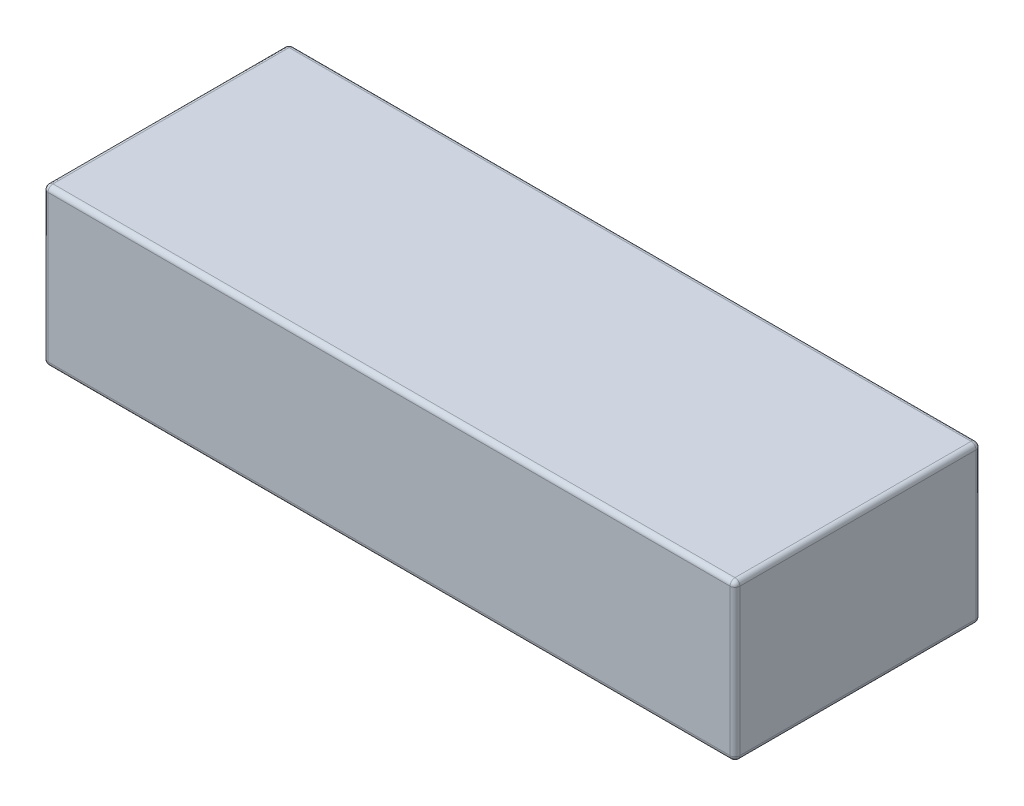
ISO-10303-21;
HEADER;
FILE_DESCRIPTION(('STEP AP214'),'2;1');
FILE_NAME('part.step','',(''),(''),'','','');
FILE_SCHEMA(('AUTOMOTIVE_DESIGN { 1 0 10303 214 1 1 1 1 }'));
ENDSEC;
DATA;
#1=APPLICATION_CONTEXT('core data for automotive mechanical design processes');
#2=APPLICATION_PROTOCOL_DEFINITION('international standard','automotive_design',2000,#1);
#3=PRODUCT_CONTEXT('',#1,'mechanical');
#4=PRODUCT('Part','Part','',(#3));
#5=PRODUCT_RELATED_PRODUCT_CATEGORY('part','',(#4));
#6=PRODUCT_DEFINITION_FORMATION('','',#4);
#7=PRODUCT_DEFINITION_CONTEXT('part definition',#1,'design');
#8=PRODUCT_DEFINITION('design','',#6,#7);
#9=PRODUCT_DEFINITION_SHAPE('','',#8);
#10=(LENGTH_UNIT() NAMED_UNIT(*) SI_UNIT(.MILLI.,.METRE.));
#11=(NAMED_UNIT(*) PLANE_ANGLE_UNIT() SI_UNIT($,.RADIAN.));
#12=(NAMED_UNIT(*) SI_UNIT($,.STERADIAN.) SOLID_ANGLE_UNIT());
#13=UNCERTAINTY_MEASURE_WITH_UNIT(LENGTH_MEASURE(1.E-05),#10,'distance_accuracy_value','');
#14=(GEOMETRIC_REPRESENTATION_CONTEXT(3) GLOBAL_UNCERTAINTY_ASSIGNED_CONTEXT((#13)) GLOBAL_UNIT_ASSIGNED_CONTEXT((#10,
#11,#12)) REPRESENTATION_CONTEXT('',''));
#15=CARTESIAN_POINT('',(0.,0.,0.));
#16=DIRECTION('',(0.,0.,1.));
#17=DIRECTION('',(1.,0.,0.));
#18=AXIS2_PLACEMENT_3D('',#15,#16,#17);
#19=CARTESIAN_POINT('',(70.05,15.85,-24.9));
#20=DIRECTION('',(-1.,0.,0.));
#21=DIRECTION('',(0.,0.,1.));
#22=AXIS2_PLACEMENT_3D('',#19,#20,#21);
#23=PLANE('',#22);
#24=DIRECTION('',(0.,-1.,0.));
#25=VECTOR('',#24,1.);
#26=CARTESIAN_POINT('',(70.05,15.85,23.9));
#27=LINE('',#26,#25);
#28=CARTESIAN_POINT('',(70.05,14.85,23.9));
#29=VERTEX_POINT('',#28);
#30=CARTESIAN_POINT('',(70.05,-14.85,23.9));
#31=VERTEX_POINT('',#30);
#32=EDGE_CURVE('E216',#29,#31,#27,.T.);
#33=ORIENTED_EDGE('',*,*,#32,.T.);
#34=DIRECTION('',(0.,0.,-1.));
#35=VECTOR('',#34,1.);
#36=CARTESIAN_POINT('',(70.05,-14.85,-24.9));
#37=LINE('',#36,#35);
#38=CARTESIAN_POINT('',(70.05,-14.85,-23.9));
#39=VERTEX_POINT('',#38);
#40=EDGE_CURVE('E60',#31,#39,#37,.T.);
#41=ORIENTED_EDGE('',*,*,#40,.T.);
#42=DIRECTION('',(0.,-1.,0.));
#43=VECTOR('',#42,1.);
#44=CARTESIAN_POINT('',(70.05,15.85,-23.9));
#45=LINE('',#44,#43);
#46=CARTESIAN_POINT('',(70.05,14.85,-23.9));
#47=VERTEX_POINT('',#46);
#48=EDGE_CURVE('E213',#39,#47,#45,.F.);
#49=ORIENTED_EDGE('',*,*,#48,.T.);
#50=DIRECTION('',(0.,0.,-1.));
#51=VECTOR('',#50,1.);
#52=CARTESIAN_POINT('',(70.05,14.85,23.9));
#53=LINE('',#52,#51);
#54=EDGE_CURVE('E217',#47,#29,#53,.F.);
#55=ORIENTED_EDGE('',*,*,#54,.T.);
#56=EDGE_LOOP('',(#33,#41,#49,#55));
#57=FACE_BOUND('',#56,.T.);
#58=ADVANCED_FACE('F35',(#57),#23,.F.);
#59=CARTESIAN_POINT('',(-70.05,15.85,-24.9));
#60=DIRECTION('',(0.,0.,1.));
#61=DIRECTION('',(1.,0.,0.));
#62=AXIS2_PLACEMENT_3D('',#59,#60,#61);
#63=PLANE('',#62);
#64=DIRECTION('',(-1.,0.,0.));
#65=VECTOR('',#64,1.);
#66=CARTESIAN_POINT('',(-70.05,-14.85,-24.9));
#67=LINE('',#66,#65);
#68=CARTESIAN_POINT('',(69.05,-14.85,-24.9));
#69=VERTEX_POINT('',#68);
#70=CARTESIAN_POINT('',(-69.05,-14.85,-24.9));
#71=VERTEX_POINT('',#70);
#72=EDGE_CURVE('E135',#69,#71,#67,.T.);
#73=ORIENTED_EDGE('',*,*,#72,.T.);
#74=DIRECTION('',(0.,-1.,0.));
#75=VECTOR('',#74,1.);
#76=CARTESIAN_POINT('',(-69.05,15.85,-24.9));
#77=LINE('',#76,#75);
#78=CARTESIAN_POINT('',(-69.05,14.85,-24.9));
#79=VERTEX_POINT('',#78);
#80=EDGE_CURVE('E129',#71,#79,#77,.F.);
#81=ORIENTED_EDGE('',*,*,#80,.T.);
#82=DIRECTION('',(-1.,0.,0.));
#83=VECTOR('',#82,1.);
#84=CARTESIAN_POINT('',(70.05,14.85,-24.9));
#85=LINE('',#84,#83);
#86=CARTESIAN_POINT('',(69.05,14.85,-24.9));
#87=VERTEX_POINT('',#86);
#88=EDGE_CURVE('E132',#79,#87,#85,.F.);
#89=ORIENTED_EDGE('',*,*,#88,.T.);
#90=DIRECTION('',(0.,-1.,0.));
#91=VECTOR('',#90,1.);
#92=CARTESIAN_POINT('',(69.05,15.85,-24.9));
#93=LINE('',#92,#91);
#94=EDGE_CURVE('E140',#87,#69,#93,.T.);
#95=ORIENTED_EDGE('',*,*,#94,.T.);
#96=EDGE_LOOP('',(#73,#81,#89,#95));
#97=FACE_BOUND('',#96,.T.);
#98=ADVANCED_FACE('F131',(#97),#63,.F.);
#99=CARTESIAN_POINT('',(-70.05,15.85,-24.9));
#100=DIRECTION('',(1.,0.,0.));
#101=DIRECTION('',(0.,0.,-1.));
#102=AXIS2_PLACEMENT_3D('',#99,#100,#101);
#103=PLANE('',#102);
#104=DIRECTION('',(0.,-1.,0.));
#105=VECTOR('',#104,1.);
#106=CARTESIAN_POINT('',(-70.05,15.85,-23.9));
#107=LINE('',#106,#105);
#108=CARTESIAN_POINT('',(-70.05,14.85,-23.9));
#109=VERTEX_POINT('',#108);
#110=CARTESIAN_POINT('',(-70.05,-14.85,-23.9));
#111=VERTEX_POINT('',#110);
#112=EDGE_CURVE('E165',#109,#111,#107,.T.);
#113=ORIENTED_EDGE('',*,*,#112,.T.);
#114=DIRECTION('',(0.,0.,1.));
#115=VECTOR('',#114,1.);
#116=CARTESIAN_POINT('',(-70.05,-14.85,-24.9));
#117=LINE('',#116,#115);
#118=CARTESIAN_POINT('',(-70.05,-14.85,23.9));
#119=VERTEX_POINT('',#118);
#120=EDGE_CURVE('E265',#111,#119,#117,.T.);
#121=ORIENTED_EDGE('',*,*,#120,.T.);
#122=DIRECTION('',(0.,-1.,0.));
#123=VECTOR('',#122,1.);
#124=CARTESIAN_POINT('',(-70.05,15.85,23.9));
#125=LINE('',#124,#123);
#126=CARTESIAN_POINT('',(-70.05,14.85,23.9));
#127=VERTEX_POINT('',#126);
#128=EDGE_CURVE('E268',#119,#127,#125,.F.);
#129=ORIENTED_EDGE('',*,*,#128,.T.);
#130=DIRECTION('',(0.,0.,1.));
#131=VECTOR('',#130,1.);
#132=CARTESIAN_POINT('',(-70.05,14.85,-23.9));
#133=LINE('',#132,#131);
#134=EDGE_CURVE('E160',#127,#109,#133,.F.);
#135=ORIENTED_EDGE('',*,*,#134,.T.);
#136=EDGE_LOOP('',(#113,#121,#129,#135));
#137=FACE_BOUND('',#136,.T.);
#138=ADVANCED_FACE('F319',(#137),#103,.F.);
#139=CARTESIAN_POINT('',(-70.05,15.85,24.9));
#140=DIRECTION('',(0.,0.,-1.));
#141=DIRECTION('',(-1.,0.,0.));
#142=AXIS2_PLACEMENT_3D('',#139,#140,#141);
#143=PLANE('',#142);
#144=DIRECTION('',(1.,0.,0.));
#145=VECTOR('',#144,1.);
#146=CARTESIAN_POINT('',(-70.05,14.85,24.9));
#147=LINE('',#146,#145);
#148=CARTESIAN_POINT('',(69.05,14.85,24.9));
#149=VERTEX_POINT('',#148);
#150=CARTESIAN_POINT('',(-69.05,14.85,24.9));
#151=VERTEX_POINT('',#150);
#152=EDGE_CURVE('E275',#149,#151,#147,.F.);
#153=ORIENTED_EDGE('',*,*,#152,.T.);
#154=DIRECTION('',(0.,-1.,0.));
#155=VECTOR('',#154,1.);
#156=CARTESIAN_POINT('',(-69.05,15.85,24.9));
#157=LINE('',#156,#155);
#158=CARTESIAN_POINT('',(-69.05,-14.85,24.9));
#159=VERTEX_POINT('',#158);
#160=EDGE_CURVE('E252',#151,#159,#157,.T.);
#161=ORIENTED_EDGE('',*,*,#160,.T.);
#162=DIRECTION('',(1.,0.,0.));
#163=VECTOR('',#162,1.);
#164=CARTESIAN_POINT('',(-70.05,-14.85,24.9));
#165=LINE('',#164,#163);
#166=CARTESIAN_POINT('',(69.05,-14.85,24.9));
#167=VERTEX_POINT('',#166);
#168=EDGE_CURVE('E272',#159,#167,#165,.T.);
#169=ORIENTED_EDGE('',*,*,#168,.T.);
#170=DIRECTION('',(0.,-1.,0.));
#171=VECTOR('',#170,1.);
#172=CARTESIAN_POINT('',(69.05,15.85,24.9));
#173=LINE('',#172,#171);
#174=EDGE_CURVE('E245',#167,#149,#173,.F.);
#175=ORIENTED_EDGE('',*,*,#174,.T.);
#176=EDGE_LOOP('',(#153,#161,#169,#175));
#177=FACE_BOUND('',#176,.T.);
#178=ADVANCED_FACE('F324',(#177),#143,.F.);
#179=CARTESIAN_POINT('',(0.,15.85,0.));
#180=DIRECTION('',(0.,1.,0.));
#181=DIRECTION('',(0.,0.,1.));
#182=AXIS2_PLACEMENT_3D('',#179,#180,#181);
#183=PLANE('',#182);
#184=DIRECTION('',(-1.,0.,0.));
#185=VECTOR('',#184,1.);
#186=CARTESIAN_POINT('',(-70.05,15.85,-23.9));
#187=LINE('',#186,#185);
#188=CARTESIAN_POINT('',(69.05,15.85,-23.9));
#189=VERTEX_POINT('',#188);
#190=CARTESIAN_POINT('',(-69.05,15.85,-23.9));
#191=VERTEX_POINT('',#190);
#192=EDGE_CURVE('E231',#189,#191,#187,.T.);
#193=ORIENTED_EDGE('',*,*,#192,.T.);
#194=DIRECTION('',(0.,0.,1.));
#195=VECTOR('',#194,1.);
#196=CARTESIAN_POINT('',(-69.05,15.85,23.9));
#197=LINE('',#196,#195);
#198=CARTESIAN_POINT('',(-69.05,15.85,23.9));
#199=VERTEX_POINT('',#198);
#200=EDGE_CURVE('E11',#191,#199,#197,.T.);
#201=ORIENTED_EDGE('',*,*,#200,.T.);
#202=DIRECTION('',(1.,0.,0.));
#203=VECTOR('',#202,1.);
#204=CARTESIAN_POINT('',(70.05,15.85,23.9));
#205=LINE('',#204,#203);
#206=CARTESIAN_POINT('',(69.05,15.85,23.9));
#207=VERTEX_POINT('',#206);
#208=EDGE_CURVE('E233',#199,#207,#205,.T.);
#209=ORIENTED_EDGE('',*,*,#208,.T.);
#210=DIRECTION('',(0.,0.,-1.));
#211=VECTOR('',#210,1.);
#212=CARTESIAN_POINT('',(69.05,15.85,-23.9));
#213=LINE('',#212,#211);
#214=EDGE_CURVE('E44',#207,#189,#213,.T.);
#215=ORIENTED_EDGE('',*,*,#214,.T.);
#216=EDGE_LOOP('',(#193,#201,#209,#215));
#217=FACE_BOUND('',#216,.T.);
#218=ADVANCED_FACE('F230',(#217),#183,.T.);
#219=CARTESIAN_POINT('',(0.,-15.85,0.));
#220=DIRECTION('',(0.,1.,0.));
#221=DIRECTION('',(0.,0.,1.));
#222=AXIS2_PLACEMENT_3D('',#219,#220,#221);
#223=PLANE('',#222);
#224=DIRECTION('',(1.,0.,0.));
#225=VECTOR('',#224,1.);
#226=CARTESIAN_POINT('',(0.,-15.85,23.9));
#227=LINE('',#226,#225);
#228=CARTESIAN_POINT('',(69.05,-15.85,23.9));
#229=VERTEX_POINT('',#228);
#230=CARTESIAN_POINT('',(-69.05,-15.85,23.9));
#231=VERTEX_POINT('',#230);
#232=EDGE_CURVE('E281',#229,#231,#227,.F.);
#233=ORIENTED_EDGE('',*,*,#232,.T.);
#234=DIRECTION('',(0.,0.,1.));
#235=VECTOR('',#234,1.);
#236=CARTESIAN_POINT('',(-69.05,-15.85,0.));
#237=LINE('',#236,#235);
#238=CARTESIAN_POINT('',(-69.05,-15.85,-23.9));
#239=VERTEX_POINT('',#238);
#240=EDGE_CURVE('E226',#231,#239,#237,.F.);
#241=ORIENTED_EDGE('',*,*,#240,.T.);
#242=DIRECTION('',(-1.,0.,0.));
#243=VECTOR('',#242,1.);
#244=CARTESIAN_POINT('',(0.,-15.85,-23.9));
#245=LINE('',#244,#243);
#246=CARTESIAN_POINT('',(69.05,-15.85,-23.9));
#247=VERTEX_POINT('',#246);
#248=EDGE_CURVE('E278',#239,#247,#245,.F.);
#249=ORIENTED_EDGE('',*,*,#248,.T.);
#250=DIRECTION('',(0.,0.,-1.));
#251=VECTOR('',#250,1.);
#252=CARTESIAN_POINT('',(69.05,-15.85,0.));
#253=LINE('',#252,#251);
#254=EDGE_CURVE('E207',#247,#229,#253,.F.);
#255=ORIENTED_EDGE('',*,*,#254,.T.);
#256=EDGE_LOOP('',(#233,#241,#249,#255));
#257=FACE_BOUND('',#256,.T.);
#258=ADVANCED_FACE('F287',(#257),#223,.F.);
#259=CARTESIAN_POINT('',(-70.05,-14.85,-23.9));
#260=DIRECTION('',(-1.,0.,0.));
#261=DIRECTION('',(0.,0.,1.));
#262=AXIS2_PLACEMENT_3D('',#259,#260,#261);
#263=CYLINDRICAL_SURFACE('',#262,1.);
#264=ORIENTED_EDGE('',*,*,#248,.F.);
#265=CARTESIAN_POINT('',(-69.05,-14.85,-23.9));
#266=DIRECTION('',(-1.,0.,0.));
#267=DIRECTION('',(0.,0.,1.));
#268=AXIS2_PLACEMENT_3D('',#265,#266,#267);
#269=CIRCLE('',#268,1.);
#270=EDGE_CURVE('E261',#239,#71,#269,.F.);
#271=ORIENTED_EDGE('',*,*,#270,.T.);
#272=ORIENTED_EDGE('',*,*,#72,.F.);
#273=CARTESIAN_POINT('',(69.05,-14.85,-23.9));
#274=DIRECTION('',(-1.,0.,0.));
#275=DIRECTION('',(0.,0.,1.));
#276=AXIS2_PLACEMENT_3D('',#273,#274,#275);
#277=CIRCLE('',#276,1.);
#278=EDGE_CURVE('E139',#69,#247,#277,.T.);
#279=ORIENTED_EDGE('',*,*,#278,.T.);
#280=EDGE_LOOP('',(#264,#271,#272,#279));
#281=FACE_BOUND('',#280,.T.);
#282=ADVANCED_FACE('F304',(#281),#263,.T.);
#283=CARTESIAN_POINT('',(-70.05,-14.85,23.9));
#284=DIRECTION('',(1.,0.,0.));
#285=DIRECTION('',(0.,0.,-1.));
#286=AXIS2_PLACEMENT_3D('',#283,#284,#285);
#287=CYLINDRICAL_SURFACE('',#286,1.);
#288=ORIENTED_EDGE('',*,*,#168,.F.);
#289=CARTESIAN_POINT('',(-69.05,-14.85,23.9));
#290=DIRECTION('',(1.,0.,0.));
#291=DIRECTION('',(0.,0.,-1.));
#292=AXIS2_PLACEMENT_3D('',#289,#290,#291);
#293=CIRCLE('',#292,1.);
#294=EDGE_CURVE('E257',#159,#231,#293,.T.);
#295=ORIENTED_EDGE('',*,*,#294,.T.);
#296=ORIENTED_EDGE('',*,*,#232,.F.);
#297=CARTESIAN_POINT('',(69.05,-14.85,23.9));
#298=DIRECTION('',(1.,0.,0.));
#299=DIRECTION('',(0.,0.,-1.));
#300=AXIS2_PLACEMENT_3D('',#297,#298,#299);
#301=CIRCLE('',#300,1.);
#302=EDGE_CURVE('E259',#229,#167,#301,.F.);
#303=ORIENTED_EDGE('',*,*,#302,.T.);
#304=EDGE_LOOP('',(#288,#295,#296,#303));
#305=FACE_BOUND('',#304,.T.);
#306=ADVANCED_FACE('F306',(#305),#287,.T.);
#307=CARTESIAN_POINT('',(0.,14.85,-23.9));
#308=DIRECTION('',(1.,0.,0.));
#309=DIRECTION('',(0.,0.,-1.));
#310=AXIS2_PLACEMENT_3D('',#307,#308,#309);
#311=CYLINDRICAL_SURFACE('',#310,1.);
#312=ORIENTED_EDGE('',*,*,#88,.F.);
#313=CARTESIAN_POINT('',(-69.05,14.85,-23.9));
#314=DIRECTION('',(1.,0.,0.));
#315=DIRECTION('',(0.,0.,-1.));
#316=AXIS2_PLACEMENT_3D('',#313,#314,#315);
#317=CIRCLE('',#316,1.);
#318=EDGE_CURVE('E147',#79,#191,#317,.T.);
#319=ORIENTED_EDGE('',*,*,#318,.T.);
#320=ORIENTED_EDGE('',*,*,#192,.F.);
#321=CARTESIAN_POINT('',(69.05,14.85,-23.9));
#322=DIRECTION('',(1.,0.,0.));
#323=DIRECTION('',(0.,0.,-1.));
#324=AXIS2_PLACEMENT_3D('',#321,#322,#323);
#325=CIRCLE('',#324,1.);
#326=EDGE_CURVE('E150',#189,#87,#325,.F.);
#327=ORIENTED_EDGE('',*,*,#326,.T.);
#328=EDGE_LOOP('',(#312,#319,#320,#327));
#329=FACE_BOUND('',#328,.T.);
#330=ADVANCED_FACE('F145',(#329),#311,.T.);
#331=CARTESIAN_POINT('',(0.,14.85,23.9));
#332=DIRECTION('',(-1.,0.,0.));
#333=DIRECTION('',(0.,0.,1.));
#334=AXIS2_PLACEMENT_3D('',#331,#332,#333);
#335=CYLINDRICAL_SURFACE('',#334,1.);
#336=ORIENTED_EDGE('',*,*,#208,.F.);
#337=CARTESIAN_POINT('',(-69.05,14.85,23.9));
#338=DIRECTION('',(-1.,0.,0.));
#339=DIRECTION('',(0.,0.,1.));
#340=AXIS2_PLACEMENT_3D('',#337,#338,#339);
#341=CIRCLE('',#340,1.);
#342=EDGE_CURVE('E220',#199,#151,#341,.F.);
#343=ORIENTED_EDGE('',*,*,#342,.T.);
#344=ORIENTED_EDGE('',*,*,#152,.F.);
#345=CARTESIAN_POINT('',(69.05,14.85,23.9));
#346=DIRECTION('',(-1.,0.,0.));
#347=DIRECTION('',(0.,0.,1.));
#348=AXIS2_PLACEMENT_3D('',#345,#346,#347);
#349=CIRCLE('',#348,1.);
#350=EDGE_CURVE('E249',#149,#207,#349,.T.);
#351=ORIENTED_EDGE('',*,*,#350,.T.);
#352=EDGE_LOOP('',(#336,#343,#344,#351));
#353=FACE_BOUND('',#352,.T.);
#354=ADVANCED_FACE('F357',(#353),#335,.T.);
#355=CARTESIAN_POINT('',(-69.05,-14.85,23.9));
#356=DIRECTION('',(0.,0.,1.));
#357=DIRECTION('',(1.,0.,0.));
#358=AXIS2_PLACEMENT_3D('',#355,#356,#357);
#359=SPHERICAL_SURFACE('',#358,1.);
#360=CARTESIAN_POINT('',(-69.05,-14.85,23.9));
#361=DIRECTION('',(0.,0.,-1.));
#362=DIRECTION('',(-1.,0.,0.));
#363=AXIS2_PLACEMENT_3D('',#360,#361,#362);
#364=CIRCLE('',#363,1.);
#365=EDGE_CURVE('E183',#231,#119,#364,.T.);
#366=ORIENTED_EDGE('',*,*,#365,.F.);
#367=ORIENTED_EDGE('',*,*,#294,.F.);
#368=CARTESIAN_POINT('',(-69.05,-14.85,23.9));
#369=DIRECTION('',(0.,1.,0.));
#370=DIRECTION('',(0.,0.,1.));
#371=AXIS2_PLACEMENT_3D('',#368,#369,#370);
#372=CIRCLE('',#371,1.);
#373=EDGE_CURVE('E151',#119,#159,#372,.T.);
#374=ORIENTED_EDGE('',*,*,#373,.F.);
#375=EDGE_LOOP('',(#366,#367,#374));
#376=FACE_BOUND('',#375,.T.);
#377=ADVANCED_FACE('F294',(#376),#359,.T.);
#378=CARTESIAN_POINT('',(-69.05,15.85,23.9));
#379=DIRECTION('',(0.,-1.,0.));
#380=DIRECTION('',(0.,0.,-1.));
#381=AXIS2_PLACEMENT_3D('',#378,#379,#380);
#382=CYLINDRICAL_SURFACE('',#381,1.);
#383=ORIENTED_EDGE('',*,*,#373,.T.);
#384=ORIENTED_EDGE('',*,*,#160,.F.);
#385=CARTESIAN_POINT('',(-69.05,14.85,23.9));
#386=DIRECTION('',(0.,1.,0.));
#387=DIRECTION('',(0.,0.,1.));
#388=AXIS2_PLACEMENT_3D('',#385,#386,#387);
#389=CIRCLE('',#388,1.);
#390=EDGE_CURVE('E180',#127,#151,#389,.T.);
#391=ORIENTED_EDGE('',*,*,#390,.F.);
#392=ORIENTED_EDGE('',*,*,#128,.F.);
#393=EDGE_LOOP('',(#383,#384,#391,#392));
#394=FACE_BOUND('',#393,.T.);
#395=ADVANCED_FACE('F374',(#394),#382,.T.);
#396=CARTESIAN_POINT('',(-69.05,-14.85,-24.9));
#397=DIRECTION('',(0.,0.,1.));
#398=DIRECTION('',(1.,0.,0.));
#399=AXIS2_PLACEMENT_3D('',#396,#397,#398);
#400=CYLINDRICAL_SURFACE('',#399,1.);
#401=ORIENTED_EDGE('',*,*,#365,.T.);
#402=ORIENTED_EDGE('',*,*,#120,.F.);
#403=CARTESIAN_POINT('',(-69.05,-14.85,-23.9));
#404=DIRECTION('',(0.,0.,-1.));
#405=DIRECTION('',(-1.,0.,0.));
#406=AXIS2_PLACEMENT_3D('',#403,#404,#405);
#407=CIRCLE('',#406,1.);
#408=EDGE_CURVE('E177',#239,#111,#407,.T.);
#409=ORIENTED_EDGE('',*,*,#408,.F.);
#410=ORIENTED_EDGE('',*,*,#240,.F.);
#411=EDGE_LOOP('',(#401,#402,#409,#410));
#412=FACE_BOUND('',#411,.T.);
#413=ADVANCED_FACE('F299',(#412),#400,.T.);
#414=CARTESIAN_POINT('',(-69.05,14.85,23.9));
#415=DIRECTION('',(0.,0.,1.));
#416=DIRECTION('',(1.,0.,0.));
#417=AXIS2_PLACEMENT_3D('',#414,#415,#416);
#418=SPHERICAL_SURFACE('',#417,1.);
#419=ORIENTED_EDGE('',*,*,#390,.T.);
#420=ORIENTED_EDGE('',*,*,#342,.F.);
#421=CARTESIAN_POINT('',(-69.05,14.85,23.9));
#422=DIRECTION('',(0.,0.,-1.));
#423=DIRECTION('',(-1.,0.,0.));
#424=AXIS2_PLACEMENT_3D('',#421,#422,#423);
#425=CIRCLE('',#424,1.);
#426=EDGE_CURVE('E174',#127,#199,#425,.T.);
#427=ORIENTED_EDGE('',*,*,#426,.F.);
#428=EDGE_LOOP('',(#419,#420,#427));
#429=FACE_BOUND('',#428,.T.);
#430=ADVANCED_FACE('F393',(#429),#418,.T.);
#431=CARTESIAN_POINT('',(-69.05,-14.85,-23.9));
#432=DIRECTION('',(0.,0.,1.));
#433=DIRECTION('',(1.,0.,0.));
#434=AXIS2_PLACEMENT_3D('',#431,#432,#433);
#435=SPHERICAL_SURFACE('',#434,1.);
#436=ORIENTED_EDGE('',*,*,#270,.F.);
#437=ORIENTED_EDGE('',*,*,#408,.T.);
#438=CARTESIAN_POINT('',(-69.05,-14.85,-23.9));
#439=DIRECTION('',(0.,1.,0.));
#440=DIRECTION('',(0.,0.,1.));
#441=AXIS2_PLACEMENT_3D('',#438,#439,#440);
#442=CIRCLE('',#441,1.);
#443=EDGE_CURVE('E167',#71,#111,#442,.T.);
#444=ORIENTED_EDGE('',*,*,#443,.F.);
#445=EDGE_LOOP('',(#436,#437,#444));
#446=FACE_BOUND('',#445,.T.);
#447=ADVANCED_FACE('F302',(#446),#435,.T.);
#448=CARTESIAN_POINT('',(-69.05,14.85,0.));
#449=DIRECTION('',(0.,0.,-1.));
#450=DIRECTION('',(-1.,0.,0.));
#451=AXIS2_PLACEMENT_3D('',#448,#449,#450);
#452=CYLINDRICAL_SURFACE('',#451,1.);
#453=ORIENTED_EDGE('',*,*,#426,.T.);
#454=ORIENTED_EDGE('',*,*,#200,.F.);
#455=CARTESIAN_POINT('',(-69.05,14.85,-23.9));
#456=DIRECTION('',(0.,0.,-1.));
#457=DIRECTION('',(-1.,0.,0.));
#458=AXIS2_PLACEMENT_3D('',#455,#456,#457);
#459=CIRCLE('',#458,1.);
#460=EDGE_CURVE('E158',#109,#191,#459,.T.);
#461=ORIENTED_EDGE('',*,*,#460,.F.);
#462=ORIENTED_EDGE('',*,*,#134,.F.);
#463=EDGE_LOOP('',(#453,#454,#461,#462));
#464=FACE_BOUND('',#463,.T.);
#465=ADVANCED_FACE('F412',(#464),#452,.T.);
#466=CARTESIAN_POINT('',(-69.05,15.85,-23.9));
#467=DIRECTION('',(0.,-1.,0.));
#468=DIRECTION('',(0.,0.,-1.));
#469=AXIS2_PLACEMENT_3D('',#466,#467,#468);
#470=CYLINDRICAL_SURFACE('',#469,1.);
#471=ORIENTED_EDGE('',*,*,#443,.T.);
#472=ORIENTED_EDGE('',*,*,#112,.F.);
#473=CARTESIAN_POINT('',(-69.05,14.85,-23.9));
#474=DIRECTION('',(0.,1.,0.));
#475=DIRECTION('',(0.,0.,1.));
#476=AXIS2_PLACEMENT_3D('',#473,#474,#475);
#477=CIRCLE('',#476,1.);
#478=EDGE_CURVE('E156',#79,#109,#477,.T.);
#479=ORIENTED_EDGE('',*,*,#478,.F.);
#480=ORIENTED_EDGE('',*,*,#80,.F.);
#481=EDGE_LOOP('',(#471,#472,#479,#480));
#482=FACE_BOUND('',#481,.T.);
#483=ADVANCED_FACE('F163',(#482),#470,.T.);
#484=CARTESIAN_POINT('',(-69.05,14.85,-23.9));
#485=DIRECTION('',(0.,0.,1.));
#486=DIRECTION('',(1.,0.,0.));
#487=AXIS2_PLACEMENT_3D('',#484,#485,#486);
#488=SPHERICAL_SURFACE('',#487,1.);
#489=ORIENTED_EDGE('',*,*,#460,.T.);
#490=ORIENTED_EDGE('',*,*,#318,.F.);
#491=ORIENTED_EDGE('',*,*,#478,.T.);
#492=EDGE_LOOP('',(#489,#490,#491));
#493=FACE_BOUND('',#492,.T.);
#494=ADVANCED_FACE('F155',(#493),#488,.T.);
#495=CARTESIAN_POINT('',(69.05,-14.85,-23.9));
#496=DIRECTION('',(0.,0.,1.));
#497=DIRECTION('',(1.,0.,0.));
#498=AXIS2_PLACEMENT_3D('',#495,#496,#497);
#499=SPHERICAL_SURFACE('',#498,1.);
#500=CARTESIAN_POINT('',(69.05,-14.85,-23.9));
#501=DIRECTION('',(0.,0.,1.));
#502=DIRECTION('',(1.,0.,0.));
#503=AXIS2_PLACEMENT_3D('',#500,#501,#502);
#504=CIRCLE('',#503,1.);
#505=EDGE_CURVE('E170',#247,#39,#504,.T.);
#506=ORIENTED_EDGE('',*,*,#505,.F.);
#507=ORIENTED_EDGE('',*,*,#278,.F.);
#508=CARTESIAN_POINT('',(69.05,-14.85,-23.9));
#509=DIRECTION('',(0.,1.,0.));
#510=DIRECTION('',(0.,0.,1.));
#511=AXIS2_PLACEMENT_3D('',#508,#509,#510);
#512=CIRCLE('',#511,1.);
#513=EDGE_CURVE('E39',#39,#69,#512,.T.);
#514=ORIENTED_EDGE('',*,*,#513,.F.);
#515=EDGE_LOOP('',(#506,#507,#514));
#516=FACE_BOUND('',#515,.T.);
#517=ADVANCED_FACE('F37',(#516),#499,.T.);
#518=CARTESIAN_POINT('',(69.05,15.85,-23.9));
#519=DIRECTION('',(0.,-1.,0.));
#520=DIRECTION('',(0.,0.,-1.));
#521=AXIS2_PLACEMENT_3D('',#518,#519,#520);
#522=CYLINDRICAL_SURFACE('',#521,1.);
#523=ORIENTED_EDGE('',*,*,#513,.T.);
#524=ORIENTED_EDGE('',*,*,#94,.F.);
#525=CARTESIAN_POINT('',(69.05,14.85,-23.9));
#526=DIRECTION('',(0.,1.,0.));
#527=DIRECTION('',(0.,0.,1.));
#528=AXIS2_PLACEMENT_3D('',#525,#526,#527);
#529=CIRCLE('',#528,1.);
#530=EDGE_CURVE('E199',#47,#87,#529,.T.);
#531=ORIENTED_EDGE('',*,*,#530,.F.);
#532=ORIENTED_EDGE('',*,*,#48,.F.);
#533=EDGE_LOOP('',(#523,#524,#531,#532));
#534=FACE_BOUND('',#533,.T.);
#535=ADVANCED_FACE('F214',(#534),#522,.T.);
#536=CARTESIAN_POINT('',(69.05,-14.85,-24.9));
#537=DIRECTION('',(0.,0.,-1.));
#538=DIRECTION('',(-1.,0.,0.));
#539=AXIS2_PLACEMENT_3D('',#536,#537,#538);
#540=CYLINDRICAL_SURFACE('',#539,1.);
#541=ORIENTED_EDGE('',*,*,#505,.T.);
#542=ORIENTED_EDGE('',*,*,#40,.F.);
#543=CARTESIAN_POINT('',(69.05,-14.85,23.9));
#544=DIRECTION('',(0.,0.,1.));
#545=DIRECTION('',(1.,0.,0.));
#546=AXIS2_PLACEMENT_3D('',#543,#544,#545);
#547=CIRCLE('',#546,1.);
#548=EDGE_CURVE('E197',#229,#31,#547,.T.);
#549=ORIENTED_EDGE('',*,*,#548,.F.);
#550=ORIENTED_EDGE('',*,*,#254,.F.);
#551=EDGE_LOOP('',(#541,#542,#549,#550));
#552=FACE_BOUND('',#551,.T.);
#553=ADVANCED_FACE('F205',(#552),#540,.T.);
#554=CARTESIAN_POINT('',(69.05,14.85,-23.9));
#555=DIRECTION('',(0.,0.,1.));
#556=DIRECTION('',(1.,0.,0.));
#557=AXIS2_PLACEMENT_3D('',#554,#555,#556);
#558=SPHERICAL_SURFACE('',#557,1.);
#559=ORIENTED_EDGE('',*,*,#530,.T.);
#560=ORIENTED_EDGE('',*,*,#326,.F.);
#561=CARTESIAN_POINT('',(69.05,14.85,-23.9));
#562=DIRECTION('',(0.,0.,1.));
#563=DIRECTION('',(1.,0.,0.));
#564=AXIS2_PLACEMENT_3D('',#561,#562,#563);
#565=CIRCLE('',#564,1.);
#566=EDGE_CURVE('E194',#47,#189,#565,.T.);
#567=ORIENTED_EDGE('',*,*,#566,.F.);
#568=EDGE_LOOP('',(#559,#560,#567));
#569=FACE_BOUND('',#568,.T.);
#570=ADVANCED_FACE('F239',(#569),#558,.T.);
#571=CARTESIAN_POINT('',(69.05,-14.85,23.9));
#572=DIRECTION('',(0.,0.,1.));
#573=DIRECTION('',(1.,0.,0.));
#574=AXIS2_PLACEMENT_3D('',#571,#572,#573);
#575=SPHERICAL_SURFACE('',#574,1.);
#576=ORIENTED_EDGE('',*,*,#302,.F.);
#577=ORIENTED_EDGE('',*,*,#548,.T.);
#578=CARTESIAN_POINT('',(69.05,-14.85,23.9));
#579=DIRECTION('',(0.,1.,0.));
#580=DIRECTION('',(0.,0.,1.));
#581=AXIS2_PLACEMENT_3D('',#578,#579,#580);
#582=CIRCLE('',#581,1.);
#583=EDGE_CURVE('E52',#167,#31,#582,.T.);
#584=ORIENTED_EDGE('',*,*,#583,.F.);
#585=EDGE_LOOP('',(#576,#577,#584));
#586=FACE_BOUND('',#585,.T.);
#587=ADVANCED_FACE('F471',(#586),#575,.T.);
#588=CARTESIAN_POINT('',(69.05,14.85,0.));
#589=DIRECTION('',(0.,0.,1.));
#590=DIRECTION('',(1.,0.,0.));
#591=AXIS2_PLACEMENT_3D('',#588,#589,#590);
#592=CYLINDRICAL_SURFACE('',#591,1.);
#593=ORIENTED_EDGE('',*,*,#566,.T.);
#594=ORIENTED_EDGE('',*,*,#214,.F.);
#595=CARTESIAN_POINT('',(69.05,14.85,23.9));
#596=DIRECTION('',(0.,0.,1.));
#597=DIRECTION('',(1.,0.,0.));
#598=AXIS2_PLACEMENT_3D('',#595,#596,#597);
#599=CIRCLE('',#598,1.);
#600=EDGE_CURVE('E191',#29,#207,#599,.T.);
#601=ORIENTED_EDGE('',*,*,#600,.F.);
#602=ORIENTED_EDGE('',*,*,#54,.F.);
#603=EDGE_LOOP('',(#593,#594,#601,#602));
#604=FACE_BOUND('',#603,.T.);
#605=ADVANCED_FACE('F242',(#604),#592,.T.);
#606=CARTESIAN_POINT('',(69.05,15.85,23.9));
#607=DIRECTION('',(0.,-1.,0.));
#608=DIRECTION('',(0.,0.,-1.));
#609=AXIS2_PLACEMENT_3D('',#606,#607,#608);
#610=CYLINDRICAL_SURFACE('',#609,1.);
#611=ORIENTED_EDGE('',*,*,#583,.T.);
#612=ORIENTED_EDGE('',*,*,#32,.F.);
#613=CARTESIAN_POINT('',(69.05,14.85,23.9));
#614=DIRECTION('',(0.,1.,0.));
#615=DIRECTION('',(0.,0.,1.));
#616=AXIS2_PLACEMENT_3D('',#613,#614,#615);
#617=CIRCLE('',#616,1.);
#618=EDGE_CURVE('E188',#149,#29,#617,.T.);
#619=ORIENTED_EDGE('',*,*,#618,.F.);
#620=ORIENTED_EDGE('',*,*,#174,.F.);
#621=EDGE_LOOP('',(#611,#612,#619,#620));
#622=FACE_BOUND('',#621,.T.);
#623=ADVANCED_FACE('F244',(#622),#610,.T.);
#624=CARTESIAN_POINT('',(69.05,14.85,23.9));
#625=DIRECTION('',(0.,0.,1.));
#626=DIRECTION('',(1.,0.,0.));
#627=AXIS2_PLACEMENT_3D('',#624,#625,#626);
#628=SPHERICAL_SURFACE('',#627,1.);
#629=ORIENTED_EDGE('',*,*,#600,.T.);
#630=ORIENTED_EDGE('',*,*,#350,.F.);
#631=ORIENTED_EDGE('',*,*,#618,.T.);
#632=EDGE_LOOP('',(#629,#630,#631));
#633=FACE_BOUND('',#632,.T.);
#634=ADVANCED_FACE('F248',(#633),#628,.T.);
#635=CLOSED_SHELL('',(#58,#98,#138,#178,#218,#258,#282,#306,#330,#354,#377,#395,#413,#430,#447,
#465,#483,#494,#517,#535,#553,#570,#587,#605,#623,#634));
#636=MANIFOLD_SOLID_BREP('B2',#635);
#637=ADVANCED_BREP_SHAPE_REPRESENTATION('',(#18,#636),#14);
#638=SHAPE_DEFINITION_REPRESENTATION(#9,#637);
ENDSEC;
END-ISO-10303-21;
